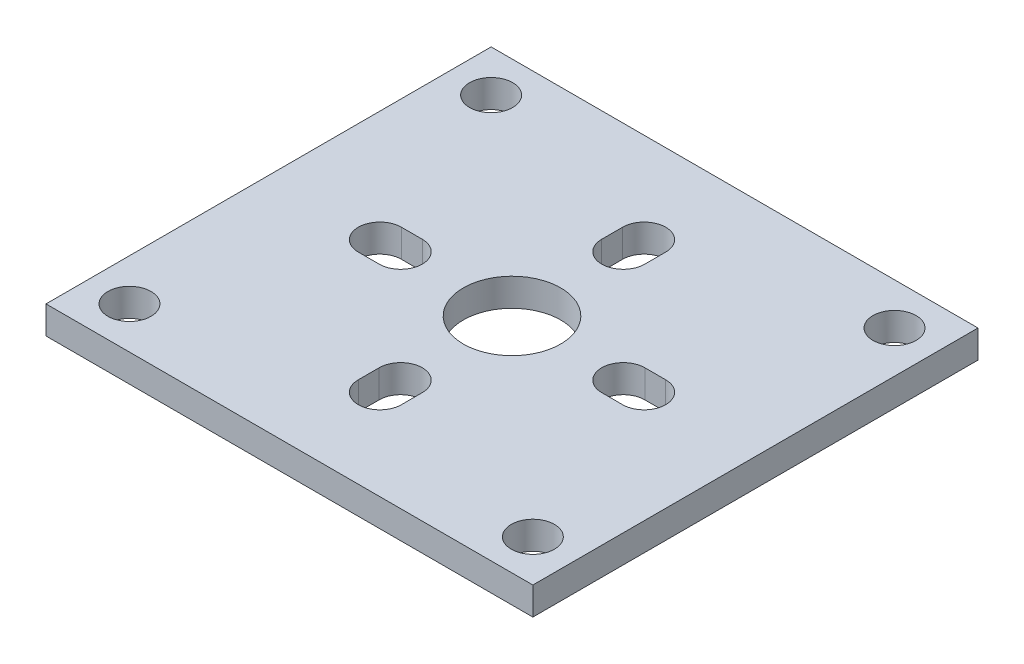
ISO-10303-21;
HEADER;
FILE_DESCRIPTION(('STEP AP214'),'2;1');
FILE_NAME('part.step','',(''),(''),'','','');
FILE_SCHEMA(('AUTOMOTIVE_DESIGN { 1 0 10303 214 1 1 1 1 }'));
ENDSEC;
DATA;
#1=APPLICATION_CONTEXT('core data for automotive mechanical design processes');
#2=APPLICATION_PROTOCOL_DEFINITION('international standard','automotive_design',2000,#1);
#3=PRODUCT_CONTEXT('',#1,'mechanical');
#4=PRODUCT('Part','Part','',(#3));
#5=PRODUCT_RELATED_PRODUCT_CATEGORY('part','',(#4));
#6=PRODUCT_DEFINITION_FORMATION('','',#4);
#7=PRODUCT_DEFINITION_CONTEXT('part definition',#1,'design');
#8=PRODUCT_DEFINITION('design','',#6,#7);
#9=PRODUCT_DEFINITION_SHAPE('','',#8);
#10=(LENGTH_UNIT() NAMED_UNIT(*) SI_UNIT(.MILLI.,.METRE.));
#11=(NAMED_UNIT(*) PLANE_ANGLE_UNIT() SI_UNIT($,.RADIAN.));
#12=(NAMED_UNIT(*) SI_UNIT($,.STERADIAN.) SOLID_ANGLE_UNIT());
#13=UNCERTAINTY_MEASURE_WITH_UNIT(LENGTH_MEASURE(1.E-05),#10,'distance_accuracy_value','');
#14=(GEOMETRIC_REPRESENTATION_CONTEXT(3) GLOBAL_UNCERTAINTY_ASSIGNED_CONTEXT((#13)) GLOBAL_UNIT_ASSIGNED_CONTEXT((#10,
#11,#12)) REPRESENTATION_CONTEXT('',''));
#15=CARTESIAN_POINT('',(0.,0.,0.));
#16=DIRECTION('',(0.,0.,1.));
#17=DIRECTION('',(1.,0.,0.));
#18=AXIS2_PLACEMENT_3D('',#15,#16,#17);
#19=CARTESIAN_POINT('',(0.,2.,0.));
#20=DIRECTION('',(0.,1.,0.));
#21=DIRECTION('',(0.,0.,1.));
#22=AXIS2_PLACEMENT_3D('',#19,#20,#21);
#23=PLANE('',#22);
#24=CARTESIAN_POINT('',(14.5,2.,-13.));
#25=DIRECTION('',(0.,1.,0.));
#26=DIRECTION('',(0.,0.,-1.));
#27=AXIS2_PLACEMENT_3D('',#24,#25,#26);
#28=CIRCLE('',#27,1.55);
#29=CARTESIAN_POINT('',(14.5,2.,-14.55));
#30=VERTEX_POINT('',#29);
#31=EDGE_CURVE('E357',#30,#30,#28,.T.);
#32=ORIENTED_EDGE('',*,*,#31,.F.);
#33=EDGE_LOOP('',(#32));
#34=FACE_BOUND('',#33,.T.);
#35=CARTESIAN_POINT('',(14.5,2.,13.));
#36=DIRECTION('',(0.,1.,0.));
#37=DIRECTION('',(0.,0.,1.));
#38=AXIS2_PLACEMENT_3D('',#35,#36,#37);
#39=CIRCLE('',#38,1.55);
#40=CARTESIAN_POINT('',(14.5,2.,14.55));
#41=VERTEX_POINT('',#40);
#42=EDGE_CURVE('E360',#41,#41,#39,.T.);
#43=ORIENTED_EDGE('',*,*,#42,.F.);
#44=EDGE_LOOP('',(#43));
#45=FACE_BOUND('',#44,.T.);
#46=CARTESIAN_POINT('',(-14.5,2.,13.));
#47=DIRECTION('',(0.,1.,0.));
#48=DIRECTION('',(0.,0.,-1.));
#49=AXIS2_PLACEMENT_3D('',#46,#47,#48);
#50=CIRCLE('',#49,1.55);
#51=CARTESIAN_POINT('',(-14.5,2.,11.45));
#52=VERTEX_POINT('',#51);
#53=EDGE_CURVE('E356',#52,#52,#50,.T.);
#54=ORIENTED_EDGE('',*,*,#53,.F.);
#55=EDGE_LOOP('',(#54));
#56=FACE_BOUND('',#55,.T.);
#57=CARTESIAN_POINT('',(-14.5,2.,-13.));
#58=DIRECTION('',(0.,1.,0.));
#59=DIRECTION('',(0.,0.,1.));
#60=AXIS2_PLACEMENT_3D('',#57,#58,#59);
#61=CIRCLE('',#60,1.55);
#62=CARTESIAN_POINT('',(-14.5,2.,-11.45));
#63=VERTEX_POINT('',#62);
#64=EDGE_CURVE('E338',#63,#63,#61,.T.);
#65=ORIENTED_EDGE('',*,*,#64,.F.);
#66=EDGE_LOOP('',(#65));
#67=FACE_BOUND('',#66,.T.);
#68=DIRECTION('',(-1.,0.,0.));
#69=VECTOR('',#68,1.);
#70=CARTESIAN_POINT('',(9.50000000000002,2.,-1.5499999999999));
#71=LINE('',#70,#69);
#72=CARTESIAN_POINT('',(9.50000000000002,2.,-1.5499999999999));
#73=VERTEX_POINT('',#72);
#74=CARTESIAN_POINT('',(8.00000000000002,2.,-1.54999999999992));
#75=VERTEX_POINT('',#74);
#76=EDGE_CURVE('E185',#73,#75,#71,.T.);
#77=ORIENTED_EDGE('',*,*,#76,.F.);
#78=CARTESIAN_POINT('',(9.5,2.,1.00613961606655E-13));
#79=DIRECTION('',(0.,1.,0.));
#80=DIRECTION('',(0.,0.,-1.));
#81=AXIS2_PLACEMENT_3D('',#78,#79,#80);
#82=CIRCLE('',#81,1.55);
#83=CARTESIAN_POINT('',(9.49999999999998,2.,1.5500000000001));
#84=VERTEX_POINT('',#83);
#85=EDGE_CURVE('E177',#84,#73,#82,.T.);
#86=ORIENTED_EDGE('',*,*,#85,.F.);
#87=DIRECTION('',(1.,0.,0.));
#88=VECTOR('',#87,1.);
#89=CARTESIAN_POINT('',(9.49999999999998,2.,1.5500000000001));
#90=LINE('',#89,#88);
#91=CARTESIAN_POINT('',(7.99999999999998,2.,1.55000000000008));
#92=VERTEX_POINT('',#91);
#93=EDGE_CURVE('E200',#92,#84,#90,.T.);
#94=ORIENTED_EDGE('',*,*,#93,.F.);
#95=CARTESIAN_POINT('',(8.,2.,0.));
#96=DIRECTION('',(0.,1.,0.));
#97=DIRECTION('',(0.,0.,-1.));
#98=AXIS2_PLACEMENT_3D('',#95,#96,#97);
#99=CIRCLE('',#98,1.55);
#100=EDGE_CURVE('E198',#75,#92,#99,.T.);
#101=ORIENTED_EDGE('',*,*,#100,.F.);
#102=EDGE_LOOP('',(#77,#86,#94,#101));
#103=FACE_BOUND('',#102,.T.);
#104=DIRECTION('',(-1.,0.,0.));
#105=VECTOR('',#104,1.);
#106=CARTESIAN_POINT('',(-9.49999999999999,2.,-1.5500000000001));
#107=LINE('',#106,#105);
#108=CARTESIAN_POINT('',(-7.99999999999998,2.,-1.55000000000009));
#109=VERTEX_POINT('',#108);
#110=CARTESIAN_POINT('',(-9.49999999999999,2.,-1.5500000000001));
#111=VERTEX_POINT('',#110);
#112=EDGE_CURVE('E218',#109,#111,#107,.T.);
#113=ORIENTED_EDGE('',*,*,#112,.F.);
#114=CARTESIAN_POINT('',(-8.,2.,0.));
#115=DIRECTION('',(0.,1.,0.));
#116=DIRECTION('',(0.,0.,1.));
#117=AXIS2_PLACEMENT_3D('',#114,#115,#116);
#118=CIRCLE('',#117,1.55);
#119=CARTESIAN_POINT('',(-8.00000000000002,2.,1.54999999999991));
#120=VERTEX_POINT('',#119);
#121=EDGE_CURVE('E216',#120,#109,#118,.T.);
#122=ORIENTED_EDGE('',*,*,#121,.F.);
#123=DIRECTION('',(1.,0.,0.));
#124=VECTOR('',#123,1.);
#125=CARTESIAN_POINT('',(-9.50000000000002,2.,1.5499999999999));
#126=LINE('',#125,#124);
#127=CARTESIAN_POINT('',(-9.50000000000002,2.,1.5499999999999));
#128=VERTEX_POINT('',#127);
#129=EDGE_CURVE('E224',#128,#120,#126,.T.);
#130=ORIENTED_EDGE('',*,*,#129,.F.);
#131=CARTESIAN_POINT('',(-9.5,2.,-1.02348685082632E-13));
#132=DIRECTION('',(0.,1.,0.));
#133=DIRECTION('',(0.,0.,1.));
#134=AXIS2_PLACEMENT_3D('',#131,#132,#133);
#135=CIRCLE('',#134,1.55);
#136=EDGE_CURVE('E221',#111,#128,#135,.T.);
#137=ORIENTED_EDGE('',*,*,#136,.F.);
#138=EDGE_LOOP('',(#113,#122,#130,#137));
#139=FACE_BOUND('',#138,.T.);
#140=DIRECTION('',(0.,0.,-1.));
#141=VECTOR('',#140,1.);
#142=CARTESIAN_POINT('',(1.55,2.,9.5));
#143=LINE('',#142,#141);
#144=CARTESIAN_POINT('',(1.55,2.,9.5));
#145=VERTEX_POINT('',#144);
#146=CARTESIAN_POINT('',(1.55,2.,8.));
#147=VERTEX_POINT('',#146);
#148=EDGE_CURVE('E249',#145,#147,#143,.T.);
#149=ORIENTED_EDGE('',*,*,#148,.F.);
#150=CARTESIAN_POINT('',(0.,2.,9.5));
#151=DIRECTION('',(0.,1.,0.));
#152=DIRECTION('',(0.,0.,-1.));
#153=AXIS2_PLACEMENT_3D('',#150,#151,#152);
#154=CIRCLE('',#153,1.55);
#155=CARTESIAN_POINT('',(-1.55,2.,9.50000000000001));
#156=VERTEX_POINT('',#155);
#157=EDGE_CURVE('E247',#156,#145,#154,.T.);
#158=ORIENTED_EDGE('',*,*,#157,.F.);
#159=DIRECTION('',(0.,0.,1.));
#160=VECTOR('',#159,1.);
#161=CARTESIAN_POINT('',(-1.55,2.,9.50000000000001));
#162=LINE('',#161,#160);
#163=CARTESIAN_POINT('',(-1.55,2.,8.00000000000001));
#164=VERTEX_POINT('',#163);
#165=EDGE_CURVE('E255',#164,#156,#162,.T.);
#166=ORIENTED_EDGE('',*,*,#165,.F.);
#167=CARTESIAN_POINT('',(0.,2.,8.));
#168=DIRECTION('',(0.,1.,0.));
#169=DIRECTION('',(0.,0.,-1.));
#170=AXIS2_PLACEMENT_3D('',#167,#168,#169);
#171=CIRCLE('',#170,1.55);
#172=EDGE_CURVE('E252',#147,#164,#171,.T.);
#173=ORIENTED_EDGE('',*,*,#172,.F.);
#174=EDGE_LOOP('',(#149,#158,#166,#173));
#175=FACE_BOUND('',#174,.T.);
#176=DIRECTION('',(0.,0.,1.));
#177=VECTOR('',#176,1.);
#178=CARTESIAN_POINT('',(-1.55,2.,-9.5));
#179=LINE('',#178,#177);
#180=CARTESIAN_POINT('',(-1.55,2.,-9.5));
#181=VERTEX_POINT('',#180);
#182=CARTESIAN_POINT('',(-1.55,2.,-8.));
#183=VERTEX_POINT('',#182);
#184=EDGE_CURVE('E280',#181,#183,#179,.T.);
#185=ORIENTED_EDGE('',*,*,#184,.F.);
#186=CARTESIAN_POINT('',(0.,2.,-9.5));
#187=DIRECTION('',(0.,1.,0.));
#188=DIRECTION('',(0.,0.,1.));
#189=AXIS2_PLACEMENT_3D('',#186,#187,#188);
#190=CIRCLE('',#189,1.55);
#191=CARTESIAN_POINT('',(1.55,2.,-9.5));
#192=VERTEX_POINT('',#191);
#193=EDGE_CURVE('E278',#192,#181,#190,.T.);
#194=ORIENTED_EDGE('',*,*,#193,.F.);
#195=DIRECTION('',(0.,0.,-1.));
#196=VECTOR('',#195,1.);
#197=CARTESIAN_POINT('',(1.55,2.,-9.5));
#198=LINE('',#197,#196);
#199=CARTESIAN_POINT('',(1.55,2.,-8.));
#200=VERTEX_POINT('',#199);
#201=EDGE_CURVE('E286',#200,#192,#198,.T.);
#202=ORIENTED_EDGE('',*,*,#201,.F.);
#203=CARTESIAN_POINT('',(0.,2.,-8.));
#204=DIRECTION('',(0.,1.,0.));
#205=DIRECTION('',(0.,0.,1.));
#206=AXIS2_PLACEMENT_3D('',#203,#204,#205);
#207=CIRCLE('',#206,1.55);
#208=EDGE_CURVE('E283',#183,#200,#207,.T.);
#209=ORIENTED_EDGE('',*,*,#208,.F.);
#210=EDGE_LOOP('',(#185,#194,#202,#209));
#211=FACE_BOUND('',#210,.T.);
#212=DIRECTION('',(0.,0.,1.));
#213=VECTOR('',#212,1.);
#214=CARTESIAN_POINT('',(-17.5,2.,16.));
#215=LINE('',#214,#213);
#216=CARTESIAN_POINT('',(-17.5,2.,-16.));
#217=VERTEX_POINT('',#216);
#218=CARTESIAN_POINT('',(-17.5,2.,16.));
#219=VERTEX_POINT('',#218);
#220=EDGE_CURVE('E309',#217,#219,#215,.T.);
#221=ORIENTED_EDGE('',*,*,#220,.T.);
#222=DIRECTION('',(1.,0.,0.));
#223=VECTOR('',#222,1.);
#224=CARTESIAN_POINT('',(17.5,2.,16.));
#225=LINE('',#224,#223);
#226=CARTESIAN_POINT('',(17.5,2.,16.));
#227=VERTEX_POINT('',#226);
#228=EDGE_CURVE('E312',#219,#227,#225,.T.);
#229=ORIENTED_EDGE('',*,*,#228,.T.);
#230=DIRECTION('',(0.,0.,-1.));
#231=VECTOR('',#230,1.);
#232=CARTESIAN_POINT('',(17.5,2.,16.));
#233=LINE('',#232,#231);
#234=CARTESIAN_POINT('',(17.5,2.,-16.));
#235=VERTEX_POINT('',#234);
#236=EDGE_CURVE('E315',#227,#235,#233,.T.);
#237=ORIENTED_EDGE('',*,*,#236,.T.);
#238=DIRECTION('',(-1.,0.,0.));
#239=VECTOR('',#238,1.);
#240=CARTESIAN_POINT('',(17.5,2.,-16.));
#241=LINE('',#240,#239);
#242=EDGE_CURVE('E317',#235,#217,#241,.T.);
#243=ORIENTED_EDGE('',*,*,#242,.T.);
#244=EDGE_LOOP('',(#221,#229,#237,#243));
#245=FACE_BOUND('',#244,.T.);
#246=CARTESIAN_POINT('',(0.,2.,0.));
#247=DIRECTION('',(0.,1.,0.));
#248=DIRECTION('',(0.,0.,1.));
#249=AXIS2_PLACEMENT_3D('',#246,#247,#248);
#250=CIRCLE('',#249,3.5);
#251=CARTESIAN_POINT('',(0.,2.,3.5));
#252=VERTEX_POINT('',#251);
#253=EDGE_CURVE('E206',#252,#252,#250,.T.);
#254=ORIENTED_EDGE('',*,*,#253,.F.);
#255=EDGE_LOOP('',(#254));
#256=FACE_BOUND('',#255,.T.);
#257=ADVANCED_FACE('F38',(#34,#45,#56,#67,#103,#139,#175,#211,#245,#256),#23,.T.);
#258=CARTESIAN_POINT('',(0.,0.,0.));
#259=DIRECTION('',(0.,1.,0.));
#260=DIRECTION('',(0.,0.,1.));
#261=AXIS2_PLACEMENT_3D('',#258,#259,#260);
#262=PLANE('',#261);
#263=CARTESIAN_POINT('',(14.5,0.,-13.));
#264=DIRECTION('',(0.,1.,0.));
#265=DIRECTION('',(0.,0.,1.));
#266=AXIS2_PLACEMENT_3D('',#263,#264,#265);
#267=CIRCLE('',#266,1.55);
#268=CARTESIAN_POINT('',(14.5,0.,-11.45));
#269=VERTEX_POINT('',#268);
#270=EDGE_CURVE('E42',#269,#269,#267,.T.);
#271=ORIENTED_EDGE('',*,*,#270,.T.);
#272=EDGE_LOOP('',(#271));
#273=FACE_BOUND('',#272,.T.);
#274=CARTESIAN_POINT('',(14.5,0.,13.));
#275=DIRECTION('',(0.,1.,0.));
#276=DIRECTION('',(0.,0.,1.));
#277=AXIS2_PLACEMENT_3D('',#274,#275,#276);
#278=CIRCLE('',#277,1.55);
#279=CARTESIAN_POINT('',(14.5,0.,14.55));
#280=VERTEX_POINT('',#279);
#281=EDGE_CURVE('E340',#280,#280,#278,.T.);
#282=ORIENTED_EDGE('',*,*,#281,.T.);
#283=EDGE_LOOP('',(#282));
#284=FACE_BOUND('',#283,.T.);
#285=CARTESIAN_POINT('',(-14.5,0.,13.));
#286=DIRECTION('',(0.,1.,0.));
#287=DIRECTION('',(0.,0.,1.));
#288=AXIS2_PLACEMENT_3D('',#285,#286,#287);
#289=CIRCLE('',#288,1.55);
#290=CARTESIAN_POINT('',(-14.5,0.,14.55));
#291=VERTEX_POINT('',#290);
#292=EDGE_CURVE('E337',#291,#291,#289,.T.);
#293=ORIENTED_EDGE('',*,*,#292,.T.);
#294=EDGE_LOOP('',(#293));
#295=FACE_BOUND('',#294,.T.);
#296=CARTESIAN_POINT('',(-14.5,0.,-13.));
#297=DIRECTION('',(0.,1.,0.));
#298=DIRECTION('',(0.,0.,1.));
#299=AXIS2_PLACEMENT_3D('',#296,#297,#298);
#300=CIRCLE('',#299,1.55);
#301=CARTESIAN_POINT('',(-14.5,0.,-11.45));
#302=VERTEX_POINT('',#301);
#303=EDGE_CURVE('E334',#302,#302,#300,.T.);
#304=ORIENTED_EDGE('',*,*,#303,.T.);
#305=EDGE_LOOP('',(#304));
#306=FACE_BOUND('',#305,.T.);
#307=CARTESIAN_POINT('',(-8.,0.,0.));
#308=DIRECTION('',(0.,1.,0.));
#309=DIRECTION('',(0.,0.,1.));
#310=AXIS2_PLACEMENT_3D('',#307,#308,#309);
#311=CIRCLE('',#310,1.55);
#312=CARTESIAN_POINT('',(-8.00000000000002,0.,1.54999999999991));
#313=VERTEX_POINT('',#312);
#314=CARTESIAN_POINT('',(-7.99999999999998,0.,-1.55000000000009));
#315=VERTEX_POINT('',#314);
#316=EDGE_CURVE('E193',#313,#315,#311,.T.);
#317=ORIENTED_EDGE('',*,*,#316,.T.);
#318=DIRECTION('',(-1.,0.,0.));
#319=VECTOR('',#318,1.);
#320=CARTESIAN_POINT('',(-9.49999999999999,0.,-1.5500000000001));
#321=LINE('',#320,#319);
#322=CARTESIAN_POINT('',(-9.49999999999999,0.,-1.5500000000001));
#323=VERTEX_POINT('',#322);
#324=EDGE_CURVE('E229',#315,#323,#321,.T.);
#325=ORIENTED_EDGE('',*,*,#324,.T.);
#326=CARTESIAN_POINT('',(-9.5,0.,-1.02348685082632E-13));
#327=DIRECTION('',(0.,1.,0.));
#328=DIRECTION('',(0.,0.,1.));
#329=AXIS2_PLACEMENT_3D('',#326,#327,#328);
#330=CIRCLE('',#329,1.55);
#331=CARTESIAN_POINT('',(-9.50000000000002,0.,1.5499999999999));
#332=VERTEX_POINT('',#331);
#333=EDGE_CURVE('E232',#323,#332,#330,.T.);
#334=ORIENTED_EDGE('',*,*,#333,.T.);
#335=DIRECTION('',(1.,0.,0.));
#336=VECTOR('',#335,1.);
#337=CARTESIAN_POINT('',(-9.50000000000002,0.,1.5499999999999));
#338=LINE('',#337,#336);
#339=EDGE_CURVE('E219',#332,#313,#338,.T.);
#340=ORIENTED_EDGE('',*,*,#339,.T.);
#341=EDGE_LOOP('',(#317,#325,#334,#340));
#342=FACE_BOUND('',#341,.T.);
#343=CARTESIAN_POINT('',(0.,0.,-9.5));
#344=DIRECTION('',(0.,1.,0.));
#345=DIRECTION('',(0.,0.,1.));
#346=AXIS2_PLACEMENT_3D('',#343,#344,#345);
#347=CIRCLE('',#346,1.55);
#348=CARTESIAN_POINT('',(1.55,0.,-9.5));
#349=VERTEX_POINT('',#348);
#350=CARTESIAN_POINT('',(-1.55,0.,-9.5));
#351=VERTEX_POINT('',#350);
#352=EDGE_CURVE('E277',#349,#351,#347,.T.);
#353=ORIENTED_EDGE('',*,*,#352,.T.);
#354=DIRECTION('',(0.,0.,1.));
#355=VECTOR('',#354,1.);
#356=CARTESIAN_POINT('',(-1.55,0.,-9.5));
#357=LINE('',#356,#355);
#358=CARTESIAN_POINT('',(-1.55,0.,-8.));
#359=VERTEX_POINT('',#358);
#360=EDGE_CURVE('E291',#351,#359,#357,.T.);
#361=ORIENTED_EDGE('',*,*,#360,.T.);
#362=CARTESIAN_POINT('',(0.,0.,-8.));
#363=DIRECTION('',(0.,1.,0.));
#364=DIRECTION('',(0.,0.,1.));
#365=AXIS2_PLACEMENT_3D('',#362,#363,#364);
#366=CIRCLE('',#365,1.55);
#367=CARTESIAN_POINT('',(1.55,0.,-8.));
#368=VERTEX_POINT('',#367);
#369=EDGE_CURVE('E294',#359,#368,#366,.T.);
#370=ORIENTED_EDGE('',*,*,#369,.T.);
#371=DIRECTION('',(0.,0.,-1.));
#372=VECTOR('',#371,1.);
#373=CARTESIAN_POINT('',(1.55,0.,-9.5));
#374=LINE('',#373,#372);
#375=EDGE_CURVE('E281',#368,#349,#374,.T.);
#376=ORIENTED_EDGE('',*,*,#375,.T.);
#377=EDGE_LOOP('',(#353,#361,#370,#376));
#378=FACE_BOUND('',#377,.T.);
#379=DIRECTION('',(0.,0.,1.));
#380=VECTOR('',#379,1.);
#381=CARTESIAN_POINT('',(-17.5,0.,16.));
#382=LINE('',#381,#380);
#383=CARTESIAN_POINT('',(-17.5,0.,-16.));
#384=VERTEX_POINT('',#383);
#385=CARTESIAN_POINT('',(-17.5,0.,16.));
#386=VERTEX_POINT('',#385);
#387=EDGE_CURVE('E308',#384,#386,#382,.T.);
#388=ORIENTED_EDGE('',*,*,#387,.F.);
#389=DIRECTION('',(-1.,0.,0.));
#390=VECTOR('',#389,1.);
#391=CARTESIAN_POINT('',(17.5,0.,-16.));
#392=LINE('',#391,#390);
#393=CARTESIAN_POINT('',(17.5,0.,-16.));
#394=VERTEX_POINT('',#393);
#395=EDGE_CURVE('E313',#394,#384,#392,.T.);
#396=ORIENTED_EDGE('',*,*,#395,.F.);
#397=DIRECTION('',(0.,0.,-1.));
#398=VECTOR('',#397,1.);
#399=CARTESIAN_POINT('',(17.5,0.,16.));
#400=LINE('',#399,#398);
#401=CARTESIAN_POINT('',(17.5,0.,16.));
#402=VERTEX_POINT('',#401);
#403=EDGE_CURVE('E324',#402,#394,#400,.T.);
#404=ORIENTED_EDGE('',*,*,#403,.F.);
#405=DIRECTION('',(1.,0.,0.));
#406=VECTOR('',#405,1.);
#407=CARTESIAN_POINT('',(17.5,0.,16.));
#408=LINE('',#407,#406);
#409=EDGE_CURVE('E322',#386,#402,#408,.T.);
#410=ORIENTED_EDGE('',*,*,#409,.F.);
#411=EDGE_LOOP('',(#388,#396,#404,#410));
#412=FACE_BOUND('',#411,.T.);
#413=CARTESIAN_POINT('',(0.,0.,9.5));
#414=DIRECTION('',(0.,1.,0.));
#415=DIRECTION('',(0.,0.,-1.));
#416=AXIS2_PLACEMENT_3D('',#413,#414,#415);
#417=CIRCLE('',#416,1.55);
#418=CARTESIAN_POINT('',(-1.55,0.,9.50000000000001));
#419=VERTEX_POINT('',#418);
#420=CARTESIAN_POINT('',(1.55,0.,9.5));
#421=VERTEX_POINT('',#420);
#422=EDGE_CURVE('E246',#419,#421,#417,.T.);
#423=ORIENTED_EDGE('',*,*,#422,.T.);
#424=DIRECTION('',(0.,0.,-1.));
#425=VECTOR('',#424,1.);
#426=CARTESIAN_POINT('',(1.55,0.,9.5));
#427=LINE('',#426,#425);
#428=CARTESIAN_POINT('',(1.55,0.,8.));
#429=VERTEX_POINT('',#428);
#430=EDGE_CURVE('E260',#421,#429,#427,.T.);
#431=ORIENTED_EDGE('',*,*,#430,.T.);
#432=CARTESIAN_POINT('',(0.,0.,8.));
#433=DIRECTION('',(0.,1.,0.));
#434=DIRECTION('',(0.,0.,-1.));
#435=AXIS2_PLACEMENT_3D('',#432,#433,#434);
#436=CIRCLE('',#435,1.55);
#437=CARTESIAN_POINT('',(-1.55,0.,8.00000000000001));
#438=VERTEX_POINT('',#437);
#439=EDGE_CURVE('E263',#429,#438,#436,.T.);
#440=ORIENTED_EDGE('',*,*,#439,.T.);
#441=DIRECTION('',(0.,0.,1.));
#442=VECTOR('',#441,1.);
#443=CARTESIAN_POINT('',(-1.55,0.,9.50000000000001));
#444=LINE('',#443,#442);
#445=EDGE_CURVE('E250',#438,#419,#444,.T.);
#446=ORIENTED_EDGE('',*,*,#445,.T.);
#447=EDGE_LOOP('',(#423,#431,#440,#446));
#448=FACE_BOUND('',#447,.T.);
#449=CARTESIAN_POINT('',(9.5,0.,1.00613961606655E-13));
#450=DIRECTION('',(0.,1.,0.));
#451=DIRECTION('',(0.,0.,-1.));
#452=AXIS2_PLACEMENT_3D('',#449,#450,#451);
#453=CIRCLE('',#452,1.55);
#454=CARTESIAN_POINT('',(9.49999999999998,0.,1.5500000000001));
#455=VERTEX_POINT('',#454);
#456=CARTESIAN_POINT('',(9.50000000000002,0.,-1.5499999999999));
#457=VERTEX_POINT('',#456);
#458=EDGE_CURVE('E63',#455,#457,#453,.T.);
#459=ORIENTED_EDGE('',*,*,#458,.T.);
#460=DIRECTION('',(-1.,0.,0.));
#461=VECTOR('',#460,1.);
#462=CARTESIAN_POINT('',(9.50000000000002,0.,-1.5499999999999));
#463=LINE('',#462,#461);
#464=CARTESIAN_POINT('',(8.00000000000002,0.,-1.54999999999992));
#465=VERTEX_POINT('',#464);
#466=EDGE_CURVE('E192',#457,#465,#463,.T.);
#467=ORIENTED_EDGE('',*,*,#466,.T.);
#468=CARTESIAN_POINT('',(8.,0.,0.));
#469=DIRECTION('',(0.,1.,0.));
#470=DIRECTION('',(0.,0.,-1.));
#471=AXIS2_PLACEMENT_3D('',#468,#469,#470);
#472=CIRCLE('',#471,1.55);
#473=CARTESIAN_POINT('',(7.99999999999998,0.,1.55000000000009));
#474=VERTEX_POINT('',#473);
#475=EDGE_CURVE('E208',#465,#474,#472,.T.);
#476=ORIENTED_EDGE('',*,*,#475,.T.);
#477=DIRECTION('',(1.,0.,0.));
#478=VECTOR('',#477,1.);
#479=CARTESIAN_POINT('',(9.49999999999998,0.,1.5500000000001));
#480=LINE('',#479,#478);
#481=EDGE_CURVE('E186',#474,#455,#480,.T.);
#482=ORIENTED_EDGE('',*,*,#481,.T.);
#483=EDGE_LOOP('',(#459,#467,#476,#482));
#484=FACE_BOUND('',#483,.T.);
#485=CARTESIAN_POINT('',(0.,0.,0.));
#486=DIRECTION('',(0.,1.,0.));
#487=DIRECTION('',(0.,0.,1.));
#488=AXIS2_PLACEMENT_3D('',#485,#486,#487);
#489=CIRCLE('',#488,3.5);
#490=CARTESIAN_POINT('',(0.,0.,3.5));
#491=VERTEX_POINT('',#490);
#492=EDGE_CURVE('E345',#491,#491,#489,.T.);
#493=ORIENTED_EDGE('',*,*,#492,.T.);
#494=EDGE_LOOP('',(#493));
#495=FACE_BOUND('',#494,.T.);
#496=ADVANCED_FACE('F371',(#273,#284,#295,#306,#342,#378,#412,#448,#484,#495),#262,.F.);
#497=CARTESIAN_POINT('',(-17.5,2.,16.));
#498=DIRECTION('',(1.,0.,0.));
#499=DIRECTION('',(0.,0.,-1.));
#500=AXIS2_PLACEMENT_3D('',#497,#498,#499);
#501=PLANE('',#500);
#502=ORIENTED_EDGE('',*,*,#387,.T.);
#503=DIRECTION('',(0.,-1.,0.));
#504=VECTOR('',#503,1.);
#505=CARTESIAN_POINT('',(-17.5,2.,16.));
#506=LINE('',#505,#504);
#507=EDGE_CURVE('E11',#219,#386,#506,.T.);
#508=ORIENTED_EDGE('',*,*,#507,.F.);
#509=ORIENTED_EDGE('',*,*,#220,.F.);
#510=DIRECTION('',(0.,-1.,0.));
#511=VECTOR('',#510,1.);
#512=CARTESIAN_POINT('',(-17.5,2.,-16.));
#513=LINE('',#512,#511);
#514=EDGE_CURVE('E319',#217,#384,#513,.T.);
#515=ORIENTED_EDGE('',*,*,#514,.T.);
#516=EDGE_LOOP('',(#502,#508,#509,#515));
#517=FACE_BOUND('',#516,.T.);
#518=ADVANCED_FACE('F40',(#517),#501,.F.);
#519=CARTESIAN_POINT('',(17.5,2.,16.));
#520=DIRECTION('',(0.,0.,-1.));
#521=DIRECTION('',(-1.,0.,0.));
#522=AXIS2_PLACEMENT_3D('',#519,#520,#521);
#523=PLANE('',#522);
#524=ORIENTED_EDGE('',*,*,#409,.T.);
#525=DIRECTION('',(0.,-1.,0.));
#526=VECTOR('',#525,1.);
#527=CARTESIAN_POINT('',(17.5,2.,16.));
#528=LINE('',#527,#526);
#529=EDGE_CURVE('E47',#227,#402,#528,.T.);
#530=ORIENTED_EDGE('',*,*,#529,.F.);
#531=ORIENTED_EDGE('',*,*,#228,.F.);
#532=ORIENTED_EDGE('',*,*,#507,.T.);
#533=EDGE_LOOP('',(#524,#530,#531,#532));
#534=FACE_BOUND('',#533,.T.);
#535=ADVANCED_FACE('F464',(#534),#523,.F.);
#536=CARTESIAN_POINT('',(17.5,2.,16.));
#537=DIRECTION('',(-1.,0.,0.));
#538=DIRECTION('',(0.,0.,1.));
#539=AXIS2_PLACEMENT_3D('',#536,#537,#538);
#540=PLANE('',#539);
#541=ORIENTED_EDGE('',*,*,#403,.T.);
#542=DIRECTION('',(0.,-1.,0.));
#543=VECTOR('',#542,1.);
#544=CARTESIAN_POINT('',(17.5,2.,-16.));
#545=LINE('',#544,#543);
#546=EDGE_CURVE('E329',#235,#394,#545,.T.);
#547=ORIENTED_EDGE('',*,*,#546,.F.);
#548=ORIENTED_EDGE('',*,*,#236,.F.);
#549=ORIENTED_EDGE('',*,*,#529,.T.);
#550=EDGE_LOOP('',(#541,#547,#548,#549));
#551=FACE_BOUND('',#550,.T.);
#552=ADVANCED_FACE('F461',(#551),#540,.F.);
#553=CARTESIAN_POINT('',(17.5,2.,-16.));
#554=DIRECTION('',(0.,0.,1.));
#555=DIRECTION('',(1.,0.,0.));
#556=AXIS2_PLACEMENT_3D('',#553,#554,#555);
#557=PLANE('',#556);
#558=ORIENTED_EDGE('',*,*,#395,.T.);
#559=ORIENTED_EDGE('',*,*,#514,.F.);
#560=ORIENTED_EDGE('',*,*,#242,.F.);
#561=ORIENTED_EDGE('',*,*,#546,.T.);
#562=EDGE_LOOP('',(#558,#559,#560,#561));
#563=FACE_BOUND('',#562,.T.);
#564=ADVANCED_FACE('F456',(#563),#557,.F.);
#565=CARTESIAN_POINT('',(0.,2.,-9.5));
#566=DIRECTION('',(0.,-1.,0.));
#567=DIRECTION('',(0.,0.,-1.));
#568=AXIS2_PLACEMENT_3D('',#565,#566,#567);
#569=CYLINDRICAL_SURFACE('',#568,1.55);
#570=ORIENTED_EDGE('',*,*,#352,.F.);
#571=DIRECTION('',(0.,-1.,0.));
#572=VECTOR('',#571,1.);
#573=CARTESIAN_POINT('',(1.55,2.,-9.5));
#574=LINE('',#573,#572);
#575=EDGE_CURVE('E288',#192,#349,#574,.T.);
#576=ORIENTED_EDGE('',*,*,#575,.F.);
#577=ORIENTED_EDGE('',*,*,#193,.T.);
#578=DIRECTION('',(0.,-1.,0.));
#579=VECTOR('',#578,1.);
#580=CARTESIAN_POINT('',(-1.55,2.,-9.5));
#581=LINE('',#580,#579);
#582=EDGE_CURVE('E305',#181,#351,#581,.T.);
#583=ORIENTED_EDGE('',*,*,#582,.T.);
#584=EDGE_LOOP('',(#570,#576,#577,#583));
#585=FACE_BOUND('',#584,.T.);
#586=ADVANCED_FACE('F453',(#585),#569,.F.);
#587=CARTESIAN_POINT('',(-1.55,2.,-9.5));
#588=DIRECTION('',(1.,0.,0.));
#589=DIRECTION('',(0.,0.,-1.));
#590=AXIS2_PLACEMENT_3D('',#587,#588,#589);
#591=PLANE('',#590);
#592=ORIENTED_EDGE('',*,*,#360,.F.);
#593=ORIENTED_EDGE('',*,*,#582,.F.);
#594=ORIENTED_EDGE('',*,*,#184,.T.);
#595=DIRECTION('',(0.,-1.,0.));
#596=VECTOR('',#595,1.);
#597=CARTESIAN_POINT('',(-1.55,2.,-8.));
#598=LINE('',#597,#596);
#599=EDGE_CURVE('E303',#183,#359,#598,.T.);
#600=ORIENTED_EDGE('',*,*,#599,.T.);
#601=EDGE_LOOP('',(#592,#593,#594,#600));
#602=FACE_BOUND('',#601,.T.);
#603=ADVANCED_FACE('F449',(#602),#591,.T.);
#604=CARTESIAN_POINT('',(0.,2.,-8.));
#605=DIRECTION('',(0.,-1.,0.));
#606=DIRECTION('',(0.,0.,-1.));
#607=AXIS2_PLACEMENT_3D('',#604,#605,#606);
#608=CYLINDRICAL_SURFACE('',#607,1.55);
#609=ORIENTED_EDGE('',*,*,#369,.F.);
#610=ORIENTED_EDGE('',*,*,#599,.F.);
#611=ORIENTED_EDGE('',*,*,#208,.T.);
#612=DIRECTION('',(0.,-1.,0.));
#613=VECTOR('',#612,1.);
#614=CARTESIAN_POINT('',(1.55,2.,-8.));
#615=LINE('',#614,#613);
#616=EDGE_CURVE('E301',#200,#368,#615,.T.);
#617=ORIENTED_EDGE('',*,*,#616,.T.);
#618=EDGE_LOOP('',(#609,#610,#611,#617));
#619=FACE_BOUND('',#618,.T.);
#620=ADVANCED_FACE('F445',(#619),#608,.F.);
#621=CARTESIAN_POINT('',(1.55,2.,-9.5));
#622=DIRECTION('',(-1.,0.,0.));
#623=DIRECTION('',(0.,0.,1.));
#624=AXIS2_PLACEMENT_3D('',#621,#622,#623);
#625=PLANE('',#624);
#626=ORIENTED_EDGE('',*,*,#375,.F.);
#627=ORIENTED_EDGE('',*,*,#616,.F.);
#628=ORIENTED_EDGE('',*,*,#201,.T.);
#629=ORIENTED_EDGE('',*,*,#575,.T.);
#630=EDGE_LOOP('',(#626,#627,#628,#629));
#631=FACE_BOUND('',#630,.T.);
#632=ADVANCED_FACE('F441',(#631),#625,.T.);
#633=CARTESIAN_POINT('',(0.,2.,9.5));
#634=DIRECTION('',(0.,-1.,0.));
#635=DIRECTION('',(0.,0.,-1.));
#636=AXIS2_PLACEMENT_3D('',#633,#634,#635);
#637=CYLINDRICAL_SURFACE('',#636,1.55);
#638=ORIENTED_EDGE('',*,*,#422,.F.);
#639=DIRECTION('',(0.,-1.,0.));
#640=VECTOR('',#639,1.);
#641=CARTESIAN_POINT('',(-1.55,2.,9.50000000000001));
#642=LINE('',#641,#640);
#643=EDGE_CURVE('E257',#156,#419,#642,.T.);
#644=ORIENTED_EDGE('',*,*,#643,.F.);
#645=ORIENTED_EDGE('',*,*,#157,.T.);
#646=DIRECTION('',(0.,-1.,0.));
#647=VECTOR('',#646,1.);
#648=CARTESIAN_POINT('',(1.55,2.,9.5));
#649=LINE('',#648,#647);
#650=EDGE_CURVE('E274',#145,#421,#649,.T.);
#651=ORIENTED_EDGE('',*,*,#650,.T.);
#652=EDGE_LOOP('',(#638,#644,#645,#651));
#653=FACE_BOUND('',#652,.T.);
#654=ADVANCED_FACE('F437',(#653),#637,.F.);
#655=CARTESIAN_POINT('',(1.55,2.,9.5));
#656=DIRECTION('',(-1.,0.,0.));
#657=DIRECTION('',(0.,0.,1.));
#658=AXIS2_PLACEMENT_3D('',#655,#656,#657);
#659=PLANE('',#658);
#660=ORIENTED_EDGE('',*,*,#430,.F.);
#661=ORIENTED_EDGE('',*,*,#650,.F.);
#662=ORIENTED_EDGE('',*,*,#148,.T.);
#663=DIRECTION('',(0.,-1.,0.));
#664=VECTOR('',#663,1.);
#665=CARTESIAN_POINT('',(1.55,2.,8.));
#666=LINE('',#665,#664);
#667=EDGE_CURVE('E272',#147,#429,#666,.T.);
#668=ORIENTED_EDGE('',*,*,#667,.T.);
#669=EDGE_LOOP('',(#660,#661,#662,#668));
#670=FACE_BOUND('',#669,.T.);
#671=ADVANCED_FACE('F433',(#670),#659,.T.);
#672=CARTESIAN_POINT('',(0.,2.,8.));
#673=DIRECTION('',(0.,-1.,0.));
#674=DIRECTION('',(0.,0.,-1.));
#675=AXIS2_PLACEMENT_3D('',#672,#673,#674);
#676=CYLINDRICAL_SURFACE('',#675,1.55);
#677=ORIENTED_EDGE('',*,*,#439,.F.);
#678=ORIENTED_EDGE('',*,*,#667,.F.);
#679=ORIENTED_EDGE('',*,*,#172,.T.);
#680=DIRECTION('',(0.,-1.,0.));
#681=VECTOR('',#680,1.);
#682=CARTESIAN_POINT('',(-1.55,2.,8.00000000000001));
#683=LINE('',#682,#681);
#684=EDGE_CURVE('E270',#164,#438,#683,.T.);
#685=ORIENTED_EDGE('',*,*,#684,.T.);
#686=EDGE_LOOP('',(#677,#678,#679,#685));
#687=FACE_BOUND('',#686,.T.);
#688=ADVANCED_FACE('F429',(#687),#676,.F.);
#689=CARTESIAN_POINT('',(-1.55,2.,9.50000000000001));
#690=DIRECTION('',(1.,0.,0.));
#691=DIRECTION('',(0.,0.,-1.));
#692=AXIS2_PLACEMENT_3D('',#689,#690,#691);
#693=PLANE('',#692);
#694=ORIENTED_EDGE('',*,*,#445,.F.);
#695=ORIENTED_EDGE('',*,*,#684,.F.);
#696=ORIENTED_EDGE('',*,*,#165,.T.);
#697=ORIENTED_EDGE('',*,*,#643,.T.);
#698=EDGE_LOOP('',(#694,#695,#696,#697));
#699=FACE_BOUND('',#698,.T.);
#700=ADVANCED_FACE('F425',(#699),#693,.T.);
#701=CARTESIAN_POINT('',(-8.,2.,0.));
#702=DIRECTION('',(0.,-1.,0.));
#703=DIRECTION('',(0.,0.,-1.));
#704=AXIS2_PLACEMENT_3D('',#701,#702,#703);
#705=CYLINDRICAL_SURFACE('',#704,1.55);
#706=ORIENTED_EDGE('',*,*,#316,.F.);
#707=DIRECTION('',(0.,-1.,0.));
#708=VECTOR('',#707,1.);
#709=CARTESIAN_POINT('',(-8.00000000000002,2.,1.54999999999991));
#710=LINE('',#709,#708);
#711=EDGE_CURVE('E226',#120,#313,#710,.T.);
#712=ORIENTED_EDGE('',*,*,#711,.F.);
#713=ORIENTED_EDGE('',*,*,#121,.T.);
#714=DIRECTION('',(0.,-1.,0.));
#715=VECTOR('',#714,1.);
#716=CARTESIAN_POINT('',(-7.99999999999998,2.,-1.55000000000009));
#717=LINE('',#716,#715);
#718=EDGE_CURVE('E243',#109,#315,#717,.T.);
#719=ORIENTED_EDGE('',*,*,#718,.T.);
#720=EDGE_LOOP('',(#706,#712,#713,#719));
#721=FACE_BOUND('',#720,.T.);
#722=ADVANCED_FACE('F421',(#721),#705,.F.);
#723=CARTESIAN_POINT('',(-9.49999999999999,2.,-1.5500000000001));
#724=DIRECTION('',(0.,0.,1.));
#725=DIRECTION('',(1.,0.,0.));
#726=AXIS2_PLACEMENT_3D('',#723,#724,#725);
#727=PLANE('',#726);
#728=ORIENTED_EDGE('',*,*,#324,.F.);
#729=ORIENTED_EDGE('',*,*,#718,.F.);
#730=ORIENTED_EDGE('',*,*,#112,.T.);
#731=DIRECTION('',(0.,-1.,0.));
#732=VECTOR('',#731,1.);
#733=CARTESIAN_POINT('',(-9.49999999999999,2.,-1.5500000000001));
#734=LINE('',#733,#732);
#735=EDGE_CURVE('E241',#111,#323,#734,.T.);
#736=ORIENTED_EDGE('',*,*,#735,.T.);
#737=EDGE_LOOP('',(#728,#729,#730,#736));
#738=FACE_BOUND('',#737,.T.);
#739=ADVANCED_FACE('F417',(#738),#727,.T.);
#740=CARTESIAN_POINT('',(-9.5,2.,-1.02348685082632E-13));
#741=DIRECTION('',(0.,-1.,0.));
#742=DIRECTION('',(0.,0.,-1.));
#743=AXIS2_PLACEMENT_3D('',#740,#741,#742);
#744=CYLINDRICAL_SURFACE('',#743,1.55);
#745=ORIENTED_EDGE('',*,*,#333,.F.);
#746=ORIENTED_EDGE('',*,*,#735,.F.);
#747=ORIENTED_EDGE('',*,*,#136,.T.);
#748=DIRECTION('',(0.,-1.,0.));
#749=VECTOR('',#748,1.);
#750=CARTESIAN_POINT('',(-9.50000000000002,2.,1.5499999999999));
#751=LINE('',#750,#749);
#752=EDGE_CURVE('E239',#128,#332,#751,.T.);
#753=ORIENTED_EDGE('',*,*,#752,.T.);
#754=EDGE_LOOP('',(#745,#746,#747,#753));
#755=FACE_BOUND('',#754,.T.);
#756=ADVANCED_FACE('F413',(#755),#744,.F.);
#757=CARTESIAN_POINT('',(-9.50000000000002,2.,1.5499999999999));
#758=DIRECTION('',(0.,0.,-1.));
#759=DIRECTION('',(-1.,0.,0.));
#760=AXIS2_PLACEMENT_3D('',#757,#758,#759);
#761=PLANE('',#760);
#762=ORIENTED_EDGE('',*,*,#339,.F.);
#763=ORIENTED_EDGE('',*,*,#752,.F.);
#764=ORIENTED_EDGE('',*,*,#129,.T.);
#765=ORIENTED_EDGE('',*,*,#711,.T.);
#766=EDGE_LOOP('',(#762,#763,#764,#765));
#767=FACE_BOUND('',#766,.T.);
#768=ADVANCED_FACE('F410',(#767),#761,.T.);
#769=CARTESIAN_POINT('',(9.5,2.,1.00613961606655E-13));
#770=DIRECTION('',(0.,-1.,0.));
#771=DIRECTION('',(0.,0.,-1.));
#772=AXIS2_PLACEMENT_3D('',#769,#770,#771);
#773=CYLINDRICAL_SURFACE('',#772,1.55);
#774=ORIENTED_EDGE('',*,*,#458,.F.);
#775=DIRECTION('',(0.,-1.,0.));
#776=VECTOR('',#775,1.);
#777=CARTESIAN_POINT('',(9.49999999999998,2.,1.5500000000001));
#778=LINE('',#777,#776);
#779=EDGE_CURVE('E181',#84,#455,#778,.T.);
#780=ORIENTED_EDGE('',*,*,#779,.F.);
#781=ORIENTED_EDGE('',*,*,#85,.T.);
#782=DIRECTION('',(0.,-1.,0.));
#783=VECTOR('',#782,1.);
#784=CARTESIAN_POINT('',(9.50000000000002,2.,-1.5499999999999));
#785=LINE('',#784,#783);
#786=EDGE_CURVE('E180',#73,#457,#785,.T.);
#787=ORIENTED_EDGE('',*,*,#786,.T.);
#788=EDGE_LOOP('',(#774,#780,#781,#787));
#789=FACE_BOUND('',#788,.T.);
#790=ADVANCED_FACE('F179',(#789),#773,.F.);
#791=CARTESIAN_POINT('',(9.50000000000002,2.,-1.5499999999999));
#792=DIRECTION('',(0.,0.,1.));
#793=DIRECTION('',(1.,0.,0.));
#794=AXIS2_PLACEMENT_3D('',#791,#792,#793);
#795=PLANE('',#794);
#796=ORIENTED_EDGE('',*,*,#466,.F.);
#797=ORIENTED_EDGE('',*,*,#786,.F.);
#798=ORIENTED_EDGE('',*,*,#76,.T.);
#799=DIRECTION('',(0.,-1.,0.));
#800=VECTOR('',#799,1.);
#801=CARTESIAN_POINT('',(8.00000000000002,2.,-1.54999999999992));
#802=LINE('',#801,#800);
#803=EDGE_CURVE('E194',#75,#465,#802,.T.);
#804=ORIENTED_EDGE('',*,*,#803,.T.);
#805=EDGE_LOOP('',(#796,#797,#798,#804));
#806=FACE_BOUND('',#805,.T.);
#807=ADVANCED_FACE('F189',(#806),#795,.T.);
#808=CARTESIAN_POINT('',(8.,2.,0.));
#809=DIRECTION('',(0.,-1.,0.));
#810=DIRECTION('',(0.,0.,-1.));
#811=AXIS2_PLACEMENT_3D('',#808,#809,#810);
#812=CYLINDRICAL_SURFACE('',#811,1.55);
#813=ORIENTED_EDGE('',*,*,#475,.F.);
#814=ORIENTED_EDGE('',*,*,#803,.F.);
#815=ORIENTED_EDGE('',*,*,#100,.T.);
#816=DIRECTION('',(0.,-1.,0.));
#817=VECTOR('',#816,1.);
#818=CARTESIAN_POINT('',(7.99999999999998,2.,1.55000000000009));
#819=LINE('',#818,#817);
#820=EDGE_CURVE('E55',#92,#474,#819,.T.);
#821=ORIENTED_EDGE('',*,*,#820,.T.);
#822=EDGE_LOOP('',(#813,#814,#815,#821));
#823=FACE_BOUND('',#822,.T.);
#824=ADVANCED_FACE('F395',(#823),#812,.F.);
#825=CARTESIAN_POINT('',(9.49999999999998,2.,1.5500000000001));
#826=DIRECTION('',(0.,0.,-1.));
#827=DIRECTION('',(-1.,0.,0.));
#828=AXIS2_PLACEMENT_3D('',#825,#826,#827);
#829=PLANE('',#828);
#830=ORIENTED_EDGE('',*,*,#481,.F.);
#831=ORIENTED_EDGE('',*,*,#820,.F.);
#832=ORIENTED_EDGE('',*,*,#93,.T.);
#833=ORIENTED_EDGE('',*,*,#779,.T.);
#834=EDGE_LOOP('',(#830,#831,#832,#833));
#835=FACE_BOUND('',#834,.T.);
#836=ADVANCED_FACE('F393',(#835),#829,.T.);
#837=CARTESIAN_POINT('',(0.,2.,0.));
#838=DIRECTION('',(0.,-1.,0.));
#839=DIRECTION('',(0.,0.,-1.));
#840=AXIS2_PLACEMENT_3D('',#837,#838,#839);
#841=CYLINDRICAL_SURFACE('',#840,3.5);
#842=ORIENTED_EDGE('',*,*,#253,.T.);
#843=EDGE_LOOP('',(#842));
#844=FACE_BOUND('',#843,.T.);
#845=ORIENTED_EDGE('',*,*,#492,.F.);
#846=EDGE_LOOP('',(#845));
#847=FACE_BOUND('',#846,.T.);
#848=ADVANCED_FACE('F379',(#844,#847),#841,.F.);
#849=CARTESIAN_POINT('',(-14.5,-8.,-13.));
#850=DIRECTION('',(0.,1.,0.));
#851=DIRECTION('',(0.,0.,1.));
#852=AXIS2_PLACEMENT_3D('',#849,#850,#851);
#853=CYLINDRICAL_SURFACE('',#852,1.55);
#854=ORIENTED_EDGE('',*,*,#64,.T.);
#855=EDGE_LOOP('',(#854));
#856=FACE_BOUND('',#855,.T.);
#857=ORIENTED_EDGE('',*,*,#303,.F.);
#858=EDGE_LOOP('',(#857));
#859=FACE_BOUND('',#858,.T.);
#860=ADVANCED_FACE('F376',(#856,#859),#853,.F.);
#861=CARTESIAN_POINT('',(-14.5,-8.,13.));
#862=DIRECTION('',(0.,1.,0.));
#863=DIRECTION('',(0.,0.,1.));
#864=AXIS2_PLACEMENT_3D('',#861,#862,#863);
#865=CYLINDRICAL_SURFACE('',#864,1.55);
#866=ORIENTED_EDGE('',*,*,#53,.T.);
#867=EDGE_LOOP('',(#866));
#868=FACE_BOUND('',#867,.T.);
#869=ORIENTED_EDGE('',*,*,#292,.F.);
#870=EDGE_LOOP('',(#869));
#871=FACE_BOUND('',#870,.T.);
#872=ADVANCED_FACE('F366',(#868,#871),#865,.F.);
#873=CARTESIAN_POINT('',(14.5,-8.,13.));
#874=DIRECTION('',(0.,1.,0.));
#875=DIRECTION('',(0.,0.,1.));
#876=AXIS2_PLACEMENT_3D('',#873,#874,#875);
#877=CYLINDRICAL_SURFACE('',#876,1.55);
#878=ORIENTED_EDGE('',*,*,#42,.T.);
#879=EDGE_LOOP('',(#878));
#880=FACE_BOUND('',#879,.T.);
#881=ORIENTED_EDGE('',*,*,#281,.F.);
#882=EDGE_LOOP('',(#881));
#883=FACE_BOUND('',#882,.T.);
#884=ADVANCED_FACE('F675',(#880,#883),#877,.F.);
#885=CARTESIAN_POINT('',(14.5,-8.,-13.));
#886=DIRECTION('',(0.,1.,0.));
#887=DIRECTION('',(0.,0.,1.));
#888=AXIS2_PLACEMENT_3D('',#885,#886,#887);
#889=CYLINDRICAL_SURFACE('',#888,1.55);
#890=ORIENTED_EDGE('',*,*,#31,.T.);
#891=EDGE_LOOP('',(#890));
#892=FACE_BOUND('',#891,.T.);
#893=ORIENTED_EDGE('',*,*,#270,.F.);
#894=EDGE_LOOP('',(#893));
#895=FACE_BOUND('',#894,.T.);
#896=ADVANCED_FACE('F684',(#892,#895),#889,.F.);
#897=CLOSED_SHELL('',(#257,#496,#518,#535,#552,#564,#586,#603,#620,#632,#654,#671,#688,#700,
#722,#739,#756,#768,#790,#807,#824,#836,#848,#860,#872,#884,#896));
#898=MANIFOLD_SOLID_BREP('B2',#897);
#899=ADVANCED_BREP_SHAPE_REPRESENTATION('',(#18,#898),#14);
#900=SHAPE_DEFINITION_REPRESENTATION(#9,#899);
ENDSEC;
END-ISO-10303-21;
